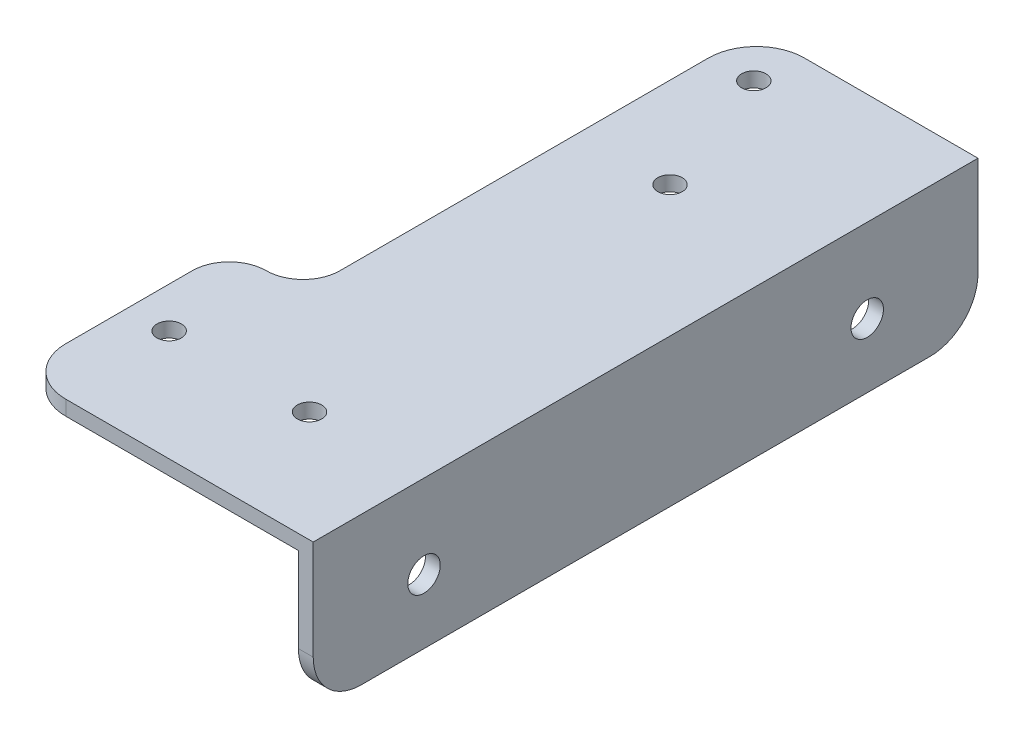
ISO-10303-21;
HEADER;
FILE_DESCRIPTION(('STEP AP214'),'2;1');
FILE_NAME('part.step','',(''),(''),'','','');
FILE_SCHEMA(('AUTOMOTIVE_DESIGN { 1 0 10303 214 1 1 1 1 }'));
ENDSEC;
DATA;
#1=APPLICATION_CONTEXT('core data for automotive mechanical design processes');
#2=APPLICATION_PROTOCOL_DEFINITION('international standard','automotive_design',2000,#1);
#3=PRODUCT_CONTEXT('',#1,'mechanical');
#4=PRODUCT('Part','Part','',(#3));
#5=PRODUCT_RELATED_PRODUCT_CATEGORY('part','',(#4));
#6=PRODUCT_DEFINITION_FORMATION('','',#4);
#7=PRODUCT_DEFINITION_CONTEXT('part definition',#1,'design');
#8=PRODUCT_DEFINITION('design','',#6,#7);
#9=PRODUCT_DEFINITION_SHAPE('','',#8);
#10=(LENGTH_UNIT() NAMED_UNIT(*) SI_UNIT(.MILLI.,.METRE.));
#11=(NAMED_UNIT(*) PLANE_ANGLE_UNIT() SI_UNIT($,.RADIAN.));
#12=(NAMED_UNIT(*) SI_UNIT($,.STERADIAN.) SOLID_ANGLE_UNIT());
#13=UNCERTAINTY_MEASURE_WITH_UNIT(LENGTH_MEASURE(1.E-05),#10,'distance_accuracy_value','');
#14=(GEOMETRIC_REPRESENTATION_CONTEXT(3) GLOBAL_UNCERTAINTY_ASSIGNED_CONTEXT((#13)) GLOBAL_UNIT_ASSIGNED_CONTEXT((#10,
#11,#12)) REPRESENTATION_CONTEXT('',''));
#15=CARTESIAN_POINT('',(0.,0.,0.));
#16=DIRECTION('',(0.,0.,1.));
#17=DIRECTION('',(1.,0.,0.));
#18=AXIS2_PLACEMENT_3D('',#15,#16,#17);
#19=CARTESIAN_POINT('',(0.,-2.,100.));
#20=DIRECTION('',(0.,1.,0.));
#21=DIRECTION('',(0.,0.,1.));
#22=AXIS2_PLACEMENT_3D('',#19,#20,#21);
#23=PLANE('',#22);
#24=CARTESIAN_POINT('',(5.5,-2.,80.));
#25=DIRECTION('',(0.,1.,0.));
#26=DIRECTION('',(0.,0.,1.));
#27=AXIS2_PLACEMENT_3D('',#24,#25,#26);
#28=CIRCLE('',#27,1.65);
#29=CARTESIAN_POINT('',(5.5,-2.,81.65));
#30=VERTEX_POINT('',#29);
#31=EDGE_CURVE('E348',#30,#30,#28,.F.);
#32=ORIENTED_EDGE('',*,*,#31,.F.);
#33=EDGE_LOOP('',(#32));
#34=FACE_BOUND('',#33,.T.);
#35=CARTESIAN_POINT('',(15.7508086384063,-2.,11.1));
#36=DIRECTION('',(0.,1.,0.));
#37=DIRECTION('',(0.,0.,1.));
#38=AXIS2_PLACEMENT_3D('',#35,#36,#37);
#39=CIRCLE('',#38,1.65);
#40=CARTESIAN_POINT('',(15.7508086384063,-2.,12.75));
#41=VERTEX_POINT('',#40);
#42=EDGE_CURVE('E325',#41,#41,#39,.F.);
#43=ORIENTED_EDGE('',*,*,#42,.F.);
#44=EDGE_LOOP('',(#43));
#45=FACE_BOUND('',#44,.T.);
#46=CARTESIAN_POINT('',(22.2579055696932,-2.,28.9509856738174));
#47=DIRECTION('',(0.,1.,0.));
#48=DIRECTION('',(0.,0.,1.));
#49=AXIS2_PLACEMENT_3D('',#46,#47,#48);
#50=CIRCLE('',#49,1.65);
#51=CARTESIAN_POINT('',(22.2579055696932,-2.,30.6009856738174));
#52=VERTEX_POINT('',#51);
#53=EDGE_CURVE('E336',#52,#52,#50,.F.);
#54=ORIENTED_EDGE('',*,*,#53,.F.);
#55=EDGE_LOOP('',(#54));
#56=FACE_BOUND('',#55,.T.);
#57=CARTESIAN_POINT('',(24.5,-2.,80.));
#58=DIRECTION('',(0.,1.,0.));
#59=DIRECTION('',(0.,0.,1.));
#60=AXIS2_PLACEMENT_3D('',#57,#58,#59);
#61=CIRCLE('',#60,1.65);
#62=CARTESIAN_POINT('',(24.5,-2.,81.65));
#63=VERTEX_POINT('',#62);
#64=EDGE_CURVE('E340',#63,#63,#61,.F.);
#65=ORIENTED_EDGE('',*,*,#64,.F.);
#66=EDGE_LOOP('',(#65));
#67=FACE_BOUND('',#66,.T.);
#68=DIRECTION('',(-1.,0.,0.));
#69=VECTOR('',#68,1.);
#70=CARTESIAN_POINT('',(0.,-2.,95.));
#71=LINE('',#70,#69);
#72=CARTESIAN_POINT('',(38.,-2.,95.));
#73=VERTEX_POINT('',#72);
#74=CARTESIAN_POINT('',(6.5,-2.,95.));
#75=VERTEX_POINT('',#74);
#76=EDGE_CURVE('E157',#73,#75,#71,.T.);
#77=ORIENTED_EDGE('',*,*,#76,.T.);
#78=CARTESIAN_POINT('',(6.5,-2.,88.5));
#79=DIRECTION('',(0.,1.,0.));
#80=DIRECTION('',(0.,0.,1.));
#81=AXIS2_PLACEMENT_3D('',#78,#79,#80);
#82=CIRCLE('',#81,6.5);
#83=CARTESIAN_POINT('',(0.,-2.,88.5));
#84=VERTEX_POINT('',#83);
#85=EDGE_CURVE('E32',#75,#84,#82,.F.);
#86=ORIENTED_EDGE('',*,*,#85,.T.);
#87=DIRECTION('',(0.,0.,-1.));
#88=VECTOR('',#87,1.);
#89=CARTESIAN_POINT('',(0.,-2.,100.));
#90=LINE('',#89,#88);
#91=CARTESIAN_POINT('',(0.,-2.,71.3705410182374));
#92=VERTEX_POINT('',#91);
#93=EDGE_CURVE('E195',#84,#92,#90,.T.);
#94=ORIENTED_EDGE('',*,*,#93,.T.);
#95=CARTESIAN_POINT('',(5.,-2.,71.3705410182374));
#96=DIRECTION('',(0.,1.,0.));
#97=DIRECTION('',(0.,0.,1.));
#98=AXIS2_PLACEMENT_3D('',#95,#96,#97);
#99=CIRCLE('',#98,5.);
#100=CARTESIAN_POINT('',(5.,-2.,66.3705410182374));
#101=VERTEX_POINT('',#100);
#102=EDGE_CURVE('E226',#92,#101,#99,.F.);
#103=ORIENTED_EDGE('',*,*,#102,.T.);
#104=CARTESIAN_POINT('',(5.,-2.,61.3705410182374));
#105=DIRECTION('',(0.,1.,0.));
#106=DIRECTION('',(0.,0.,1.));
#107=AXIS2_PLACEMENT_3D('',#104,#105,#106);
#108=CIRCLE('',#107,5.);
#109=CARTESIAN_POINT('',(10.,-2.,61.3705410182374));
#110=VERTEX_POINT('',#109);
#111=EDGE_CURVE('E218',#101,#110,#108,.T.);
#112=ORIENTED_EDGE('',*,*,#111,.T.);
#113=DIRECTION('',(0.,0.,1.));
#114=VECTOR('',#113,1.);
#115=CARTESIAN_POINT('',(10.,-2.,100.));
#116=LINE('',#115,#114);
#117=CARTESIAN_POINT('',(10.,-2.,11.5));
#118=VERTEX_POINT('',#117);
#119=EDGE_CURVE('E317',#118,#110,#116,.T.);
#120=ORIENTED_EDGE('',*,*,#119,.F.);
#121=CARTESIAN_POINT('',(16.5,-2.,11.5));
#122=DIRECTION('',(0.,1.,0.));
#123=DIRECTION('',(0.,0.,1.));
#124=AXIS2_PLACEMENT_3D('',#121,#122,#123);
#125=CIRCLE('',#124,6.5);
#126=CARTESIAN_POINT('',(16.5,-2.,5.));
#127=VERTEX_POINT('',#126);
#128=EDGE_CURVE('E273',#118,#127,#125,.F.);
#129=ORIENTED_EDGE('',*,*,#128,.T.);
#130=DIRECTION('',(1.,0.,0.));
#131=VECTOR('',#130,1.);
#132=CARTESIAN_POINT('',(0.,-2.,5.));
#133=LINE('',#132,#131);
#134=CARTESIAN_POINT('',(38.,-2.,5.));
#135=VERTEX_POINT('',#134);
#136=EDGE_CURVE('E293',#127,#135,#133,.T.);
#137=ORIENTED_EDGE('',*,*,#136,.T.);
#138=DIRECTION('',(0.,0.,-1.));
#139=VECTOR('',#138,1.);
#140=CARTESIAN_POINT('',(38.,-2.,100.));
#141=LINE('',#140,#139);
#142=EDGE_CURVE('E191',#73,#135,#141,.T.);
#143=ORIENTED_EDGE('',*,*,#142,.F.);
#144=EDGE_LOOP('',(#77,#86,#94,#103,#112,#120,#129,#137,#143));
#145=FACE_BOUND('',#144,.T.);
#146=ADVANCED_FACE('F23',(#34,#45,#56,#67,#145),#23,.F.);
#147=CARTESIAN_POINT('',(0.,0.,100.));
#148=DIRECTION('',(0.,-1.,0.));
#149=DIRECTION('',(0.,0.,-1.));
#150=AXIS2_PLACEMENT_3D('',#147,#148,#149);
#151=PLANE('',#150);
#152=CARTESIAN_POINT('',(5.5,0.,80.));
#153=DIRECTION('',(0.,-1.,0.));
#154=DIRECTION('',(0.,0.,-1.));
#155=AXIS2_PLACEMENT_3D('',#152,#153,#154);
#156=CIRCLE('',#155,1.65);
#157=CARTESIAN_POINT('',(5.5,0.,78.35));
#158=VERTEX_POINT('',#157);
#159=EDGE_CURVE('E344',#158,#158,#156,.T.);
#160=ORIENTED_EDGE('',*,*,#159,.T.);
#161=EDGE_LOOP('',(#160));
#162=FACE_BOUND('',#161,.T.);
#163=CARTESIAN_POINT('',(15.7508086384063,0.,11.1));
#164=DIRECTION('',(0.,-1.,0.));
#165=DIRECTION('',(0.,0.,-1.));
#166=AXIS2_PLACEMENT_3D('',#163,#164,#165);
#167=CIRCLE('',#166,1.65);
#168=CARTESIAN_POINT('',(15.7508086384063,0.,9.45));
#169=VERTEX_POINT('',#168);
#170=EDGE_CURVE('E320',#169,#169,#167,.T.);
#171=ORIENTED_EDGE('',*,*,#170,.T.);
#172=EDGE_LOOP('',(#171));
#173=FACE_BOUND('',#172,.T.);
#174=CARTESIAN_POINT('',(22.2579055696932,0.,28.9509856738174));
#175=DIRECTION('',(0.,-1.,0.));
#176=DIRECTION('',(0.,0.,-1.));
#177=AXIS2_PLACEMENT_3D('',#174,#175,#176);
#178=CIRCLE('',#177,1.65);
#179=CARTESIAN_POINT('',(22.2579055696932,0.,27.3009856738175));
#180=VERTEX_POINT('',#179);
#181=EDGE_CURVE('E326',#180,#180,#178,.T.);
#182=ORIENTED_EDGE('',*,*,#181,.T.);
#183=EDGE_LOOP('',(#182));
#184=FACE_BOUND('',#183,.T.);
#185=CARTESIAN_POINT('',(24.5,0.,80.));
#186=DIRECTION('',(0.,-1.,0.));
#187=DIRECTION('',(0.,0.,-1.));
#188=AXIS2_PLACEMENT_3D('',#185,#186,#187);
#189=CIRCLE('',#188,1.65);
#190=CARTESIAN_POINT('',(24.5,0.,78.35));
#191=VERTEX_POINT('',#190);
#192=EDGE_CURVE('E321',#191,#191,#189,.T.);
#193=ORIENTED_EDGE('',*,*,#192,.T.);
#194=EDGE_LOOP('',(#193));
#195=FACE_BOUND('',#194,.T.);
#196=DIRECTION('',(0.,0.,-1.));
#197=VECTOR('',#196,1.);
#198=CARTESIAN_POINT('',(0.,0.,100.));
#199=LINE('',#198,#197);
#200=CARTESIAN_POINT('',(0.,0.,88.5));
#201=VERTEX_POINT('',#200);
#202=CARTESIAN_POINT('',(0.,0.,71.3705410182374));
#203=VERTEX_POINT('',#202);
#204=EDGE_CURVE('E177',#201,#203,#199,.T.);
#205=ORIENTED_EDGE('',*,*,#204,.F.);
#206=CARTESIAN_POINT('',(6.5,0.,88.5));
#207=DIRECTION('',(0.,-1.,0.));
#208=DIRECTION('',(0.,0.,-1.));
#209=AXIS2_PLACEMENT_3D('',#206,#207,#208);
#210=CIRCLE('',#209,6.5);
#211=CARTESIAN_POINT('',(6.5,0.,95.));
#212=VERTEX_POINT('',#211);
#213=EDGE_CURVE('E153',#201,#212,#210,.F.);
#214=ORIENTED_EDGE('',*,*,#213,.T.);
#215=DIRECTION('',(1.,0.,0.));
#216=VECTOR('',#215,1.);
#217=CARTESIAN_POINT('',(0.,0.,95.));
#218=LINE('',#217,#216);
#219=CARTESIAN_POINT('',(40.,0.,95.));
#220=VERTEX_POINT('',#219);
#221=EDGE_CURVE('E147',#212,#220,#218,.T.);
#222=ORIENTED_EDGE('',*,*,#221,.T.);
#223=DIRECTION('',(0.,0.,-1.));
#224=VECTOR('',#223,1.);
#225=CARTESIAN_POINT('',(40.,0.,100.));
#226=LINE('',#225,#224);
#227=CARTESIAN_POINT('',(40.,0.,5.));
#228=VERTEX_POINT('',#227);
#229=EDGE_CURVE('E152',#220,#228,#226,.T.);
#230=ORIENTED_EDGE('',*,*,#229,.T.);
#231=DIRECTION('',(-1.,0.,0.));
#232=VECTOR('',#231,1.);
#233=CARTESIAN_POINT('',(0.,0.,5.));
#234=LINE('',#233,#232);
#235=CARTESIAN_POINT('',(16.5,0.,5.));
#236=VERTEX_POINT('',#235);
#237=EDGE_CURVE('E302',#228,#236,#234,.T.);
#238=ORIENTED_EDGE('',*,*,#237,.T.);
#239=CARTESIAN_POINT('',(16.5,0.,11.5));
#240=DIRECTION('',(0.,-1.,0.));
#241=DIRECTION('',(0.,0.,-1.));
#242=AXIS2_PLACEMENT_3D('',#239,#240,#241);
#243=CIRCLE('',#242,6.5);
#244=CARTESIAN_POINT('',(10.,0.,11.5));
#245=VERTEX_POINT('',#244);
#246=EDGE_CURVE('E51',#236,#245,#243,.F.);
#247=ORIENTED_EDGE('',*,*,#246,.T.);
#248=DIRECTION('',(0.,0.,-1.));
#249=VECTOR('',#248,1.);
#250=CARTESIAN_POINT('',(10.,0.,100.));
#251=LINE('',#250,#249);
#252=CARTESIAN_POINT('',(10.,0.,61.3705410182374));
#253=VERTEX_POINT('',#252);
#254=EDGE_CURVE('E314',#253,#245,#251,.T.);
#255=ORIENTED_EDGE('',*,*,#254,.F.);
#256=CARTESIAN_POINT('',(5.,0.,61.3705410182374));
#257=DIRECTION('',(0.,-1.,0.));
#258=DIRECTION('',(0.,0.,-1.));
#259=AXIS2_PLACEMENT_3D('',#256,#257,#258);
#260=CIRCLE('',#259,5.);
#261=CARTESIAN_POINT('',(5.,0.,66.3705410182374));
#262=VERTEX_POINT('',#261);
#263=EDGE_CURVE('E215',#253,#262,#260,.T.);
#264=ORIENTED_EDGE('',*,*,#263,.T.);
#265=CARTESIAN_POINT('',(5.,0.,71.3705410182374));
#266=DIRECTION('',(0.,-1.,0.));
#267=DIRECTION('',(0.,0.,-1.));
#268=AXIS2_PLACEMENT_3D('',#265,#266,#267);
#269=CIRCLE('',#268,5.);
#270=EDGE_CURVE('E229',#262,#203,#269,.F.);
#271=ORIENTED_EDGE('',*,*,#270,.T.);
#272=EDGE_LOOP('',(#205,#214,#222,#230,#238,#247,#255,#264,#271));
#273=FACE_BOUND('',#272,.T.);
#274=ADVANCED_FACE('F150',(#162,#173,#184,#195,#273),#151,.F.);
#275=CARTESIAN_POINT('',(0.,-2.,100.));
#276=DIRECTION('',(1.,0.,0.));
#277=DIRECTION('',(0.,0.,-1.));
#278=AXIS2_PLACEMENT_3D('',#275,#276,#277);
#279=PLANE('',#278);
#280=ORIENTED_EDGE('',*,*,#93,.F.);
#281=DIRECTION('',(0.,1.,0.));
#282=VECTOR('',#281,1.);
#283=CARTESIAN_POINT('',(0.,-2.,88.5));
#284=LINE('',#283,#282);
#285=EDGE_CURVE('E265',#84,#201,#284,.T.);
#286=ORIENTED_EDGE('',*,*,#285,.T.);
#287=ORIENTED_EDGE('',*,*,#204,.T.);
#288=DIRECTION('',(0.,-1.,0.));
#289=VECTOR('',#288,1.);
#290=CARTESIAN_POINT('',(0.,-2.,71.3705410182374));
#291=LINE('',#290,#289);
#292=EDGE_CURVE('E222',#203,#92,#291,.T.);
#293=ORIENTED_EDGE('',*,*,#292,.T.);
#294=EDGE_LOOP('',(#280,#286,#287,#293));
#295=FACE_BOUND('',#294,.T.);
#296=ADVANCED_FACE('F287',(#295),#279,.F.);
#297=CARTESIAN_POINT('',(38.,-2.,100.));
#298=DIRECTION('',(1.,0.,0.));
#299=DIRECTION('',(0.,0.,-1.));
#300=AXIS2_PLACEMENT_3D('',#297,#298,#299);
#301=PLANE('',#300);
#302=CARTESIAN_POINT('',(38.,-11.3,80.));
#303=DIRECTION('',(-1.,0.,0.));
#304=DIRECTION('',(0.,0.,1.));
#305=AXIS2_PLACEMENT_3D('',#302,#303,#304);
#306=CIRCLE('',#305,2.2);
#307=CARTESIAN_POINT('',(38.,-11.3,82.2));
#308=VERTEX_POINT('',#307);
#309=EDGE_CURVE('E207',#308,#308,#306,.T.);
#310=ORIENTED_EDGE('',*,*,#309,.F.);
#311=EDGE_LOOP('',(#310));
#312=FACE_BOUND('',#311,.T.);
#313=CARTESIAN_POINT('',(38.,-11.3,20.));
#314=DIRECTION('',(-1.,0.,0.));
#315=DIRECTION('',(0.,0.,1.));
#316=AXIS2_PLACEMENT_3D('',#313,#314,#315);
#317=CIRCLE('',#316,2.2);
#318=CARTESIAN_POINT('',(38.,-11.3,22.2));
#319=VERTEX_POINT('',#318);
#320=EDGE_CURVE('E202',#319,#319,#317,.T.);
#321=ORIENTED_EDGE('',*,*,#320,.F.);
#322=EDGE_LOOP('',(#321));
#323=FACE_BOUND('',#322,.T.);
#324=DIRECTION('',(0.,-1.,0.));
#325=VECTOR('',#324,1.);
#326=CARTESIAN_POINT('',(38.,-2.,5.));
#327=LINE('',#326,#325);
#328=CARTESIAN_POINT('',(38.,-13.5,5.));
#329=VERTEX_POINT('',#328);
#330=EDGE_CURVE('E298',#135,#329,#327,.T.);
#331=ORIENTED_EDGE('',*,*,#330,.T.);
#332=CARTESIAN_POINT('',(38.,-13.5,11.5));
#333=DIRECTION('',(1.,0.,0.));
#334=DIRECTION('',(0.,0.,-1.));
#335=AXIS2_PLACEMENT_3D('',#332,#333,#334);
#336=CIRCLE('',#335,6.5);
#337=CARTESIAN_POINT('',(38.,-20.,11.5));
#338=VERTEX_POINT('',#337);
#339=EDGE_CURVE('E257',#329,#338,#336,.F.);
#340=ORIENTED_EDGE('',*,*,#339,.T.);
#341=DIRECTION('',(0.,0.,-1.));
#342=VECTOR('',#341,1.);
#343=CARTESIAN_POINT('',(38.,-20.,100.));
#344=LINE('',#343,#342);
#345=CARTESIAN_POINT('',(38.,-20.,88.5));
#346=VERTEX_POINT('',#345);
#347=EDGE_CURVE('E182',#346,#338,#344,.T.);
#348=ORIENTED_EDGE('',*,*,#347,.F.);
#349=CARTESIAN_POINT('',(38.,-13.5,88.5));
#350=DIRECTION('',(1.,0.,0.));
#351=DIRECTION('',(0.,0.,-1.));
#352=AXIS2_PLACEMENT_3D('',#349,#350,#351);
#353=CIRCLE('',#352,6.5);
#354=CARTESIAN_POINT('',(38.,-13.5,95.));
#355=VERTEX_POINT('',#354);
#356=EDGE_CURVE('E254',#346,#355,#353,.F.);
#357=ORIENTED_EDGE('',*,*,#356,.T.);
#358=DIRECTION('',(0.,1.,0.));
#359=VECTOR('',#358,1.);
#360=CARTESIAN_POINT('',(38.,-2.,95.));
#361=LINE('',#360,#359);
#362=EDGE_CURVE('E168',#355,#73,#361,.T.);
#363=ORIENTED_EDGE('',*,*,#362,.T.);
#364=ORIENTED_EDGE('',*,*,#142,.T.);
#365=EDGE_LOOP('',(#331,#340,#348,#357,#363,#364));
#366=FACE_BOUND('',#365,.T.);
#367=ADVANCED_FACE('F297',(#312,#323,#366),#301,.F.);
#368=CARTESIAN_POINT('',(38.,-20.,100.));
#369=DIRECTION('',(0.,1.,0.));
#370=DIRECTION('',(0.,0.,1.));
#371=AXIS2_PLACEMENT_3D('',#368,#369,#370);
#372=PLANE('',#371);
#373=ORIENTED_EDGE('',*,*,#347,.T.);
#374=DIRECTION('',(1.,0.,0.));
#375=VECTOR('',#374,1.);
#376=CARTESIAN_POINT('',(38.,-20.,11.5));
#377=LINE('',#376,#375);
#378=CARTESIAN_POINT('',(40.,-20.,11.5));
#379=VERTEX_POINT('',#378);
#380=EDGE_CURVE('E237',#338,#379,#377,.T.);
#381=ORIENTED_EDGE('',*,*,#380,.T.);
#382=DIRECTION('',(0.,0.,-1.));
#383=VECTOR('',#382,1.);
#384=CARTESIAN_POINT('',(40.,-20.,100.));
#385=LINE('',#384,#383);
#386=CARTESIAN_POINT('',(40.,-20.,88.5));
#387=VERTEX_POINT('',#386);
#388=EDGE_CURVE('E176',#387,#379,#385,.T.);
#389=ORIENTED_EDGE('',*,*,#388,.F.);
#390=DIRECTION('',(-1.,0.,0.));
#391=VECTOR('',#390,1.);
#392=CARTESIAN_POINT('',(38.,-20.,88.5));
#393=LINE('',#392,#391);
#394=EDGE_CURVE('E233',#387,#346,#393,.T.);
#395=ORIENTED_EDGE('',*,*,#394,.T.);
#396=EDGE_LOOP('',(#373,#381,#389,#395));
#397=FACE_BOUND('',#396,.T.);
#398=ADVANCED_FACE('F363',(#397),#372,.F.);
#399=CARTESIAN_POINT('',(40.,0.,100.));
#400=DIRECTION('',(-1.,0.,0.));
#401=DIRECTION('',(0.,0.,1.));
#402=AXIS2_PLACEMENT_3D('',#399,#400,#401);
#403=PLANE('',#402);
#404=CARTESIAN_POINT('',(40.,-11.3,80.));
#405=DIRECTION('',(-1.,0.,0.));
#406=DIRECTION('',(0.,0.,1.));
#407=AXIS2_PLACEMENT_3D('',#404,#405,#406);
#408=CIRCLE('',#407,2.2);
#409=CARTESIAN_POINT('',(40.,-11.3,82.2));
#410=VERTEX_POINT('',#409);
#411=EDGE_CURVE('E203',#410,#410,#408,.T.);
#412=ORIENTED_EDGE('',*,*,#411,.T.);
#413=EDGE_LOOP('',(#412));
#414=FACE_BOUND('',#413,.T.);
#415=CARTESIAN_POINT('',(40.,-11.3,20.));
#416=DIRECTION('',(-1.,0.,0.));
#417=DIRECTION('',(0.,0.,1.));
#418=AXIS2_PLACEMENT_3D('',#415,#416,#417);
#419=CIRCLE('',#418,2.2);
#420=CARTESIAN_POINT('',(40.,-11.3,22.2));
#421=VERTEX_POINT('',#420);
#422=EDGE_CURVE('E184',#421,#421,#419,.T.);
#423=ORIENTED_EDGE('',*,*,#422,.T.);
#424=EDGE_LOOP('',(#423));
#425=FACE_BOUND('',#424,.T.);
#426=ORIENTED_EDGE('',*,*,#388,.T.);
#427=CARTESIAN_POINT('',(40.,-13.5,11.5));
#428=DIRECTION('',(-1.,0.,0.));
#429=DIRECTION('',(0.,0.,1.));
#430=AXIS2_PLACEMENT_3D('',#427,#428,#429);
#431=CIRCLE('',#430,6.5);
#432=CARTESIAN_POINT('',(40.,-13.5,5.));
#433=VERTEX_POINT('',#432);
#434=EDGE_CURVE('E244',#379,#433,#431,.F.);
#435=ORIENTED_EDGE('',*,*,#434,.T.);
#436=DIRECTION('',(0.,1.,0.));
#437=VECTOR('',#436,1.);
#438=CARTESIAN_POINT('',(40.,0.,5.));
#439=LINE('',#438,#437);
#440=EDGE_CURVE('E173',#433,#228,#439,.T.);
#441=ORIENTED_EDGE('',*,*,#440,.T.);
#442=ORIENTED_EDGE('',*,*,#229,.F.);
#443=DIRECTION('',(0.,-1.,0.));
#444=VECTOR('',#443,1.);
#445=CARTESIAN_POINT('',(40.,0.,95.));
#446=LINE('',#445,#444);
#447=CARTESIAN_POINT('',(40.,-13.5,95.));
#448=VERTEX_POINT('',#447);
#449=EDGE_CURVE('E160',#220,#448,#446,.T.);
#450=ORIENTED_EDGE('',*,*,#449,.T.);
#451=CARTESIAN_POINT('',(40.,-13.5,88.5));
#452=DIRECTION('',(-1.,0.,0.));
#453=DIRECTION('',(0.,0.,1.));
#454=AXIS2_PLACEMENT_3D('',#451,#452,#453);
#455=CIRCLE('',#454,6.5);
#456=EDGE_CURVE('E241',#448,#387,#455,.F.);
#457=ORIENTED_EDGE('',*,*,#456,.T.);
#458=EDGE_LOOP('',(#426,#435,#441,#442,#450,#457));
#459=FACE_BOUND('',#458,.T.);
#460=ADVANCED_FACE('F171',(#414,#425,#459),#403,.F.);
#461=CARTESIAN_POINT('',(118.,-11.3,20.));
#462=DIRECTION('',(-1.,0.,0.));
#463=DIRECTION('',(0.,0.,1.));
#464=AXIS2_PLACEMENT_3D('',#461,#462,#463);
#465=CYLINDRICAL_SURFACE('',#464,2.2);
#466=ORIENTED_EDGE('',*,*,#320,.T.);
#467=EDGE_LOOP('',(#466));
#468=FACE_BOUND('',#467,.T.);
#469=ORIENTED_EDGE('',*,*,#422,.F.);
#470=EDGE_LOOP('',(#469));
#471=FACE_BOUND('',#470,.T.);
#472=ADVANCED_FACE('F359',(#468,#471),#465,.F.);
#473=CARTESIAN_POINT('',(118.,-11.3,80.));
#474=DIRECTION('',(-1.,0.,0.));
#475=DIRECTION('',(0.,0.,1.));
#476=AXIS2_PLACEMENT_3D('',#473,#474,#475);
#477=CYLINDRICAL_SURFACE('',#476,2.2);
#478=ORIENTED_EDGE('',*,*,#309,.T.);
#479=EDGE_LOOP('',(#478));
#480=FACE_BOUND('',#479,.T.);
#481=ORIENTED_EDGE('',*,*,#411,.F.);
#482=EDGE_LOOP('',(#481));
#483=FACE_BOUND('',#482,.T.);
#484=ADVANCED_FACE('F441',(#480,#483),#477,.F.);
#485=CARTESIAN_POINT('',(5.5,-80.,80.));
#486=DIRECTION('',(0.,1.,0.));
#487=DIRECTION('',(0.,0.,1.));
#488=AXIS2_PLACEMENT_3D('',#485,#486,#487);
#489=CYLINDRICAL_SURFACE('',#488,1.65);
#490=ORIENTED_EDGE('',*,*,#159,.F.);
#491=EDGE_LOOP('',(#490));
#492=FACE_BOUND('',#491,.T.);
#493=ORIENTED_EDGE('',*,*,#31,.T.);
#494=EDGE_LOOP('',(#493));
#495=FACE_BOUND('',#494,.T.);
#496=ADVANCED_FACE('F437',(#492,#495),#489,.F.);
#497=CARTESIAN_POINT('',(15.7508086384063,-80.,11.1));
#498=DIRECTION('',(0.,1.,0.));
#499=DIRECTION('',(0.,0.,1.));
#500=AXIS2_PLACEMENT_3D('',#497,#498,#499);
#501=CYLINDRICAL_SURFACE('',#500,1.65);
#502=ORIENTED_EDGE('',*,*,#170,.F.);
#503=EDGE_LOOP('',(#502));
#504=FACE_BOUND('',#503,.T.);
#505=ORIENTED_EDGE('',*,*,#42,.T.);
#506=EDGE_LOOP('',(#505));
#507=FACE_BOUND('',#506,.T.);
#508=ADVANCED_FACE('F433',(#504,#507),#501,.F.);
#509=CARTESIAN_POINT('',(22.2579055696932,-80.,28.9509856738174));
#510=DIRECTION('',(0.,1.,0.));
#511=DIRECTION('',(0.,0.,1.));
#512=AXIS2_PLACEMENT_3D('',#509,#510,#511);
#513=CYLINDRICAL_SURFACE('',#512,1.65);
#514=ORIENTED_EDGE('',*,*,#181,.F.);
#515=EDGE_LOOP('',(#514));
#516=FACE_BOUND('',#515,.T.);
#517=ORIENTED_EDGE('',*,*,#53,.T.);
#518=EDGE_LOOP('',(#517));
#519=FACE_BOUND('',#518,.T.);
#520=ADVANCED_FACE('F429',(#516,#519),#513,.F.);
#521=CARTESIAN_POINT('',(24.5,-80.,80.));
#522=DIRECTION('',(0.,1.,0.));
#523=DIRECTION('',(0.,0.,1.));
#524=AXIS2_PLACEMENT_3D('',#521,#522,#523);
#525=CYLINDRICAL_SURFACE('',#524,1.65);
#526=ORIENTED_EDGE('',*,*,#192,.F.);
#527=EDGE_LOOP('',(#526));
#528=FACE_BOUND('',#527,.T.);
#529=ORIENTED_EDGE('',*,*,#64,.T.);
#530=EDGE_LOOP('',(#529));
#531=FACE_BOUND('',#530,.T.);
#532=ADVANCED_FACE('F426',(#528,#531),#525,.F.);
#533=CARTESIAN_POINT('',(10.,-22.,0.));
#534=DIRECTION('',(-1.,0.,0.));
#535=DIRECTION('',(0.,0.,1.));
#536=AXIS2_PLACEMENT_3D('',#533,#534,#535);
#537=PLANE('',#536);
#538=ORIENTED_EDGE('',*,*,#254,.T.);
#539=DIRECTION('',(0.,1.,0.));
#540=VECTOR('',#539,1.);
#541=CARTESIAN_POINT('',(10.,-2.,11.5));
#542=LINE('',#541,#540);
#543=EDGE_CURVE('E13',#245,#118,#542,.F.);
#544=ORIENTED_EDGE('',*,*,#543,.T.);
#545=ORIENTED_EDGE('',*,*,#119,.T.);
#546=DIRECTION('',(0.,1.,0.));
#547=VECTOR('',#546,1.);
#548=CARTESIAN_POINT('',(10.,-22.,61.3705410182374));
#549=LINE('',#548,#547);
#550=EDGE_CURVE('E198',#110,#253,#549,.T.);
#551=ORIENTED_EDGE('',*,*,#550,.T.);
#552=EDGE_LOOP('',(#538,#544,#545,#551));
#553=FACE_BOUND('',#552,.T.);
#554=ADVANCED_FACE('F390',(#553),#537,.T.);
#555=CARTESIAN_POINT('',(5.,-22.,61.3705410182374));
#556=DIRECTION('',(0.,1.,0.));
#557=DIRECTION('',(0.,0.,1.));
#558=AXIS2_PLACEMENT_3D('',#555,#556,#557);
#559=CYLINDRICAL_SURFACE('',#558,5.);
#560=ORIENTED_EDGE('',*,*,#111,.F.);
#561=DIRECTION('',(0.,1.,0.));
#562=VECTOR('',#561,1.);
#563=CARTESIAN_POINT('',(5.,-22.,66.3705410182374));
#564=LINE('',#563,#562);
#565=EDGE_CURVE('E211',#262,#101,#564,.F.);
#566=ORIENTED_EDGE('',*,*,#565,.F.);
#567=ORIENTED_EDGE('',*,*,#263,.F.);
#568=ORIENTED_EDGE('',*,*,#550,.F.);
#569=EDGE_LOOP('',(#560,#566,#567,#568));
#570=FACE_BOUND('',#569,.T.);
#571=ADVANCED_FACE('F386',(#570),#559,.F.);
#572=CARTESIAN_POINT('',(5.,-2.,71.3705410182374));
#573=DIRECTION('',(0.,-1.,0.));
#574=DIRECTION('',(0.,0.,-1.));
#575=AXIS2_PLACEMENT_3D('',#572,#573,#574);
#576=CYLINDRICAL_SURFACE('',#575,5.);
#577=ORIENTED_EDGE('',*,*,#270,.F.);
#578=ORIENTED_EDGE('',*,*,#565,.T.);
#579=ORIENTED_EDGE('',*,*,#102,.F.);
#580=ORIENTED_EDGE('',*,*,#292,.F.);
#581=EDGE_LOOP('',(#577,#578,#579,#580));
#582=FACE_BOUND('',#581,.T.);
#583=ADVANCED_FACE('F389',(#582),#576,.T.);
#584=CARTESIAN_POINT('',(-12.,-27.7531485769751,95.));
#585=DIRECTION('',(0.,0.,-1.));
#586=DIRECTION('',(0.,1.,0.));
#587=AXIS2_PLACEMENT_3D('',#584,#585,#586);
#588=PLANE('',#587);
#589=ORIENTED_EDGE('',*,*,#362,.F.);
#590=DIRECTION('',(-1.,0.,0.));
#591=VECTOR('',#590,1.);
#592=CARTESIAN_POINT('',(-12.,-13.5,95.));
#593=LINE('',#592,#591);
#594=EDGE_CURVE('E164',#355,#448,#593,.F.);
#595=ORIENTED_EDGE('',*,*,#594,.T.);
#596=ORIENTED_EDGE('',*,*,#449,.F.);
#597=ORIENTED_EDGE('',*,*,#221,.F.);
#598=DIRECTION('',(0.,1.,0.));
#599=VECTOR('',#598,1.);
#600=CARTESIAN_POINT('',(6.5,-27.7531485769751,95.));
#601=LINE('',#600,#599);
#602=EDGE_CURVE('E260',#212,#75,#601,.F.);
#603=ORIENTED_EDGE('',*,*,#602,.T.);
#604=ORIENTED_EDGE('',*,*,#76,.F.);
#605=EDGE_LOOP('',(#589,#595,#596,#597,#603,#604));
#606=FACE_BOUND('',#605,.T.);
#607=ADVANCED_FACE('F162',(#606),#588,.F.);
#608=CARTESIAN_POINT('',(-12.,-27.7531485769751,5.));
#609=DIRECTION('',(0.,0.,1.));
#610=DIRECTION('',(0.,-1.,0.));
#611=AXIS2_PLACEMENT_3D('',#608,#609,#610);
#612=PLANE('',#611);
#613=ORIENTED_EDGE('',*,*,#440,.F.);
#614=DIRECTION('',(1.,0.,0.));
#615=VECTOR('',#614,1.);
#616=CARTESIAN_POINT('',(-12.,-13.5,5.));
#617=LINE('',#616,#615);
#618=EDGE_CURVE('E251',#433,#329,#617,.F.);
#619=ORIENTED_EDGE('',*,*,#618,.T.);
#620=ORIENTED_EDGE('',*,*,#330,.F.);
#621=ORIENTED_EDGE('',*,*,#136,.F.);
#622=DIRECTION('',(0.,1.,0.));
#623=VECTOR('',#622,1.);
#624=CARTESIAN_POINT('',(16.5,0.,5.));
#625=LINE('',#624,#623);
#626=EDGE_CURVE('E247',#127,#236,#625,.T.);
#627=ORIENTED_EDGE('',*,*,#626,.T.);
#628=ORIENTED_EDGE('',*,*,#237,.F.);
#629=EDGE_LOOP('',(#613,#619,#620,#621,#627,#628));
#630=FACE_BOUND('',#629,.T.);
#631=ADVANCED_FACE('F399',(#630),#612,.F.);
#632=CARTESIAN_POINT('',(38.,-13.5,11.5));
#633=DIRECTION('',(1.,0.,0.));
#634=DIRECTION('',(0.,0.,-1.));
#635=AXIS2_PLACEMENT_3D('',#632,#633,#634);
#636=CYLINDRICAL_SURFACE('',#635,6.5);
#637=ORIENTED_EDGE('',*,*,#339,.F.);
#638=ORIENTED_EDGE('',*,*,#618,.F.);
#639=ORIENTED_EDGE('',*,*,#434,.F.);
#640=ORIENTED_EDGE('',*,*,#380,.F.);
#641=EDGE_LOOP('',(#637,#638,#639,#640));
#642=FACE_BOUND('',#641,.T.);
#643=ADVANCED_FACE('F395',(#642),#636,.T.);
#644=CARTESIAN_POINT('',(38.,-13.5,88.5));
#645=DIRECTION('',(-1.,0.,0.));
#646=DIRECTION('',(0.,0.,1.));
#647=AXIS2_PLACEMENT_3D('',#644,#645,#646);
#648=CYLINDRICAL_SURFACE('',#647,6.5);
#649=ORIENTED_EDGE('',*,*,#456,.F.);
#650=ORIENTED_EDGE('',*,*,#594,.F.);
#651=ORIENTED_EDGE('',*,*,#356,.F.);
#652=ORIENTED_EDGE('',*,*,#394,.F.);
#653=EDGE_LOOP('',(#649,#650,#651,#652));
#654=FACE_BOUND('',#653,.T.);
#655=ADVANCED_FACE('F398',(#654),#648,.T.);
#656=CARTESIAN_POINT('',(6.5,-2.,88.5));
#657=DIRECTION('',(0.,1.,0.));
#658=DIRECTION('',(0.,0.,1.));
#659=AXIS2_PLACEMENT_3D('',#656,#657,#658);
#660=CYLINDRICAL_SURFACE('',#659,6.5);
#661=ORIENTED_EDGE('',*,*,#85,.F.);
#662=ORIENTED_EDGE('',*,*,#602,.F.);
#663=ORIENTED_EDGE('',*,*,#213,.F.);
#664=ORIENTED_EDGE('',*,*,#285,.F.);
#665=EDGE_LOOP('',(#661,#662,#663,#664));
#666=FACE_BOUND('',#665,.T.);
#667=ADVANCED_FACE('F289',(#666),#660,.T.);
#668=CARTESIAN_POINT('',(16.5,-27.7531485769751,11.5));
#669=DIRECTION('',(0.,-1.,0.));
#670=DIRECTION('',(0.,0.,-1.));
#671=AXIS2_PLACEMENT_3D('',#668,#669,#670);
#672=CYLINDRICAL_SURFACE('',#671,6.5);
#673=ORIENTED_EDGE('',*,*,#128,.F.);
#674=ORIENTED_EDGE('',*,*,#543,.F.);
#675=ORIENTED_EDGE('',*,*,#246,.F.);
#676=ORIENTED_EDGE('',*,*,#626,.F.);
#677=EDGE_LOOP('',(#673,#674,#675,#676));
#678=FACE_BOUND('',#677,.T.);
#679=ADVANCED_FACE('F25',(#678),#672,.T.);
#680=CLOSED_SHELL('',(#146,#274,#296,#367,#398,#460,#472,#484,#496,#508,#520,#532,#554,#571,
#583,#607,#631,#643,#655,#667,#679));
#681=MANIFOLD_SOLID_BREP('B1',#680);
#682=ADVANCED_BREP_SHAPE_REPRESENTATION('',(#18,#681),#14);
#683=SHAPE_DEFINITION_REPRESENTATION(#9,#682);
ENDSEC;
END-ISO-10303-21;
